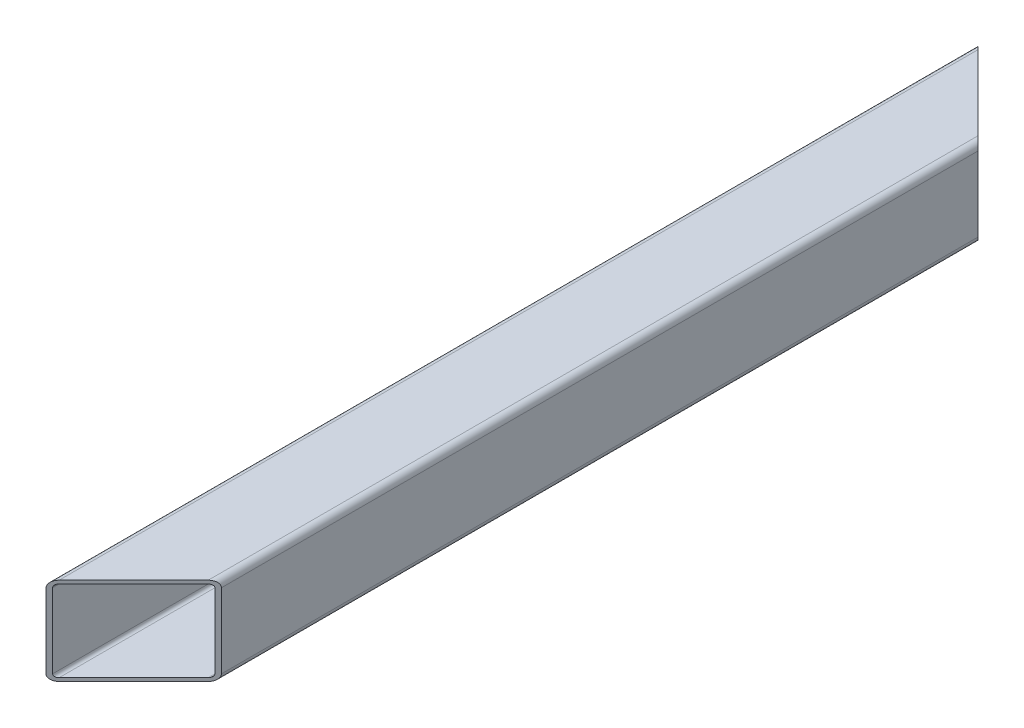
ISO-10303-21;
HEADER;
FILE_DESCRIPTION(('STEP AP214'),'2;1');
FILE_NAME('part.step','',(''),(''),'','','');
FILE_SCHEMA(('AUTOMOTIVE_DESIGN { 1 0 10303 214 1 1 1 1 }'));
ENDSEC;
DATA;
#1=APPLICATION_CONTEXT('core data for automotive mechanical design processes');
#2=APPLICATION_PROTOCOL_DEFINITION('international standard','automotive_design',2000,#1);
#3=PRODUCT_CONTEXT('',#1,'mechanical');
#4=PRODUCT('Part','Part','',(#3));
#5=PRODUCT_RELATED_PRODUCT_CATEGORY('part','',(#4));
#6=PRODUCT_DEFINITION_FORMATION('','',#4);
#7=PRODUCT_DEFINITION_CONTEXT('part definition',#1,'design');
#8=PRODUCT_DEFINITION('design','',#6,#7);
#9=PRODUCT_DEFINITION_SHAPE('','',#8);
#10=(LENGTH_UNIT() NAMED_UNIT(*) SI_UNIT(.MILLI.,.METRE.));
#11=(NAMED_UNIT(*) PLANE_ANGLE_UNIT() SI_UNIT($,.RADIAN.));
#12=(NAMED_UNIT(*) SI_UNIT($,.STERADIAN.) SOLID_ANGLE_UNIT());
#13=UNCERTAINTY_MEASURE_WITH_UNIT(LENGTH_MEASURE(1.E-05),#10,'distance_accuracy_value','');
#14=(GEOMETRIC_REPRESENTATION_CONTEXT(3) GLOBAL_UNCERTAINTY_ASSIGNED_CONTEXT((#13)) GLOBAL_UNIT_ASSIGNED_CONTEXT((#10,
#11,#12)) REPRESENTATION_CONTEXT('',''));
#15=CARTESIAN_POINT('',(0.,0.,0.));
#16=DIRECTION('',(0.,0.,1.));
#17=DIRECTION('',(1.,0.,0.));
#18=AXIS2_PLACEMENT_3D('',#15,#16,#17);
#19=CARTESIAN_POINT('',(34.,34.,425.));
#20=DIRECTION('',(0.,0.,-1.));
#21=DIRECTION('',(-1.,0.,0.));
#22=AXIS2_PLACEMENT_3D('',#19,#20,#21);
#23=CYLINDRICAL_SURFACE('',#22,5.99999999999998);
#24=DIRECTION('',(0.,0.,-1.));
#25=VECTOR('',#24,1.);
#26=CARTESIAN_POINT('',(34.,40.,425.));
#27=LINE('',#26,#25);
#28=CARTESIAN_POINT('',(34.,40.,351.000000000001));
#29=VERTEX_POINT('',#28);
#30=CARTESIAN_POINT('',(34.0000000000001,40.,-351.000000000001));
#31=VERTEX_POINT('',#30);
#32=EDGE_CURVE('E160',#29,#31,#27,.T.);
#33=ORIENTED_EDGE('',*,*,#32,.F.);
#34=CARTESIAN_POINT('',(34.,34.,351.000000000001));
#35=DIRECTION('',(-0.707106781186544,0.,-0.707106781186551));
#36=DIRECTION('',(0.707106781186551,0.,-0.707106781186544));
#37=AXIS2_PLACEMENT_3D('',#34,#35,#36);
#38=ELLIPSE('',#37,8.4852813742385,5.99999999999998);
#39=CARTESIAN_POINT('',(40.,34.,345.000000000001));
#40=VERTEX_POINT('',#39);
#41=EDGE_CURVE('E144',#29,#40,#38,.T.);
#42=ORIENTED_EDGE('',*,*,#41,.T.);
#43=DIRECTION('',(0.,0.,-1.));
#44=VECTOR('',#43,1.);
#45=CARTESIAN_POINT('',(40.,34.,425.));
#46=LINE('',#45,#44);
#47=CARTESIAN_POINT('',(40.,34.,-345.000000000001));
#48=VERTEX_POINT('',#47);
#49=EDGE_CURVE('E183',#40,#48,#46,.T.);
#50=ORIENTED_EDGE('',*,*,#49,.T.);
#51=CARTESIAN_POINT('',(34.,34.,-351.000000000001));
#52=DIRECTION('',(-0.707106781186544,0.,0.707106781186551));
#53=DIRECTION('',(-0.707106781186551,0.,-0.707106781186544));
#54=AXIS2_PLACEMENT_3D('',#51,#52,#53);
#55=ELLIPSE('',#54,8.4852813742385,5.99999999999998);
#56=EDGE_CURVE('E166',#48,#31,#55,.T.);
#57=ORIENTED_EDGE('',*,*,#56,.T.);
#58=EDGE_LOOP('',(#33,#42,#50,#57));
#59=FACE_BOUND('',#58,.T.);
#60=ADVANCED_FACE('F35',(#59),#23,.T.);
#61=CARTESIAN_POINT('',(-34.,40.,425.));
#62=DIRECTION('',(0.,-1.,0.));
#63=DIRECTION('',(0.,0.,-1.));
#64=AXIS2_PLACEMENT_3D('',#61,#62,#63);
#65=PLANE('',#64);
#66=DIRECTION('',(0.,0.,-1.));
#67=VECTOR('',#66,1.);
#68=CARTESIAN_POINT('',(-34.,40.,425.));
#69=LINE('',#68,#67);
#70=CARTESIAN_POINT('',(-34.,40.,419.));
#71=VERTEX_POINT('',#70);
#72=CARTESIAN_POINT('',(-34.,40.,-419.));
#73=VERTEX_POINT('',#72);
#74=EDGE_CURVE('E162',#71,#73,#69,.T.);
#75=ORIENTED_EDGE('',*,*,#74,.F.);
#76=DIRECTION('',(-0.707106781186551,0.,0.707106781186544));
#77=VECTOR('',#76,1.);
#78=CARTESIAN_POINT('',(40.,40.,345.000000000001));
#79=LINE('',#78,#77);
#80=EDGE_CURVE('E147',#29,#71,#79,.T.);
#81=ORIENTED_EDGE('',*,*,#80,.F.);
#82=ORIENTED_EDGE('',*,*,#32,.T.);
#83=DIRECTION('',(0.707106781186551,0.,0.707106781186544));
#84=VECTOR('',#83,1.);
#85=CARTESIAN_POINT('',(40.,40.,-345.000000000001));
#86=LINE('',#85,#84);
#87=EDGE_CURVE('E153',#73,#31,#86,.T.);
#88=ORIENTED_EDGE('',*,*,#87,.F.);
#89=EDGE_LOOP('',(#75,#81,#82,#88));
#90=FACE_BOUND('',#89,.T.);
#91=ADVANCED_FACE('F158',(#90),#65,.F.);
#92=CARTESIAN_POINT('',(-34.,34.,425.));
#93=DIRECTION('',(0.,0.,-1.));
#94=DIRECTION('',(-1.,0.,0.));
#95=AXIS2_PLACEMENT_3D('',#92,#93,#94);
#96=CYLINDRICAL_SURFACE('',#95,5.99999999999998);
#97=DIRECTION('',(0.,0.,-1.));
#98=VECTOR('',#97,1.);
#99=CARTESIAN_POINT('',(-40.,34.,425.));
#100=LINE('',#99,#98);
#101=CARTESIAN_POINT('',(-40.,34.,425.));
#102=VERTEX_POINT('',#101);
#103=CARTESIAN_POINT('',(-40.,34.,-425.));
#104=VERTEX_POINT('',#103);
#105=EDGE_CURVE('E169',#102,#104,#100,.T.);
#106=ORIENTED_EDGE('',*,*,#105,.F.);
#107=CARTESIAN_POINT('',(-34.,34.,419.));
#108=DIRECTION('',(-0.707106781186544,0.,-0.707106781186551));
#109=DIRECTION('',(0.707106781186551,0.,-0.707106781186544));
#110=AXIS2_PLACEMENT_3D('',#107,#108,#109);
#111=ELLIPSE('',#110,8.4852813742385,5.99999999999998);
#112=EDGE_CURVE('E154',#102,#71,#111,.T.);
#113=ORIENTED_EDGE('',*,*,#112,.T.);
#114=ORIENTED_EDGE('',*,*,#74,.T.);
#115=CARTESIAN_POINT('',(-34.,34.,-419.));
#116=DIRECTION('',(-0.707106781186544,0.,0.707106781186551));
#117=DIRECTION('',(-0.707106781186551,0.,-0.707106781186544));
#118=AXIS2_PLACEMENT_3D('',#115,#116,#117);
#119=ELLIPSE('',#118,8.4852813742385,5.99999999999998);
#120=EDGE_CURVE('E207',#73,#104,#119,.T.);
#121=ORIENTED_EDGE('',*,*,#120,.T.);
#122=EDGE_LOOP('',(#106,#113,#114,#121));
#123=FACE_BOUND('',#122,.T.);
#124=ADVANCED_FACE('F318',(#123),#96,.T.);
#125=CARTESIAN_POINT('',(-40.,34.,425.));
#126=DIRECTION('',(1.,0.,0.));
#127=DIRECTION('',(0.,0.,-1.));
#128=AXIS2_PLACEMENT_3D('',#125,#126,#127);
#129=PLANE('',#128);
#130=DIRECTION('',(0.,-1.,0.));
#131=VECTOR('',#130,1.);
#132=CARTESIAN_POINT('',(-40.,34.,-425.));
#133=LINE('',#132,#131);
#134=CARTESIAN_POINT('',(-40.,-34.,-425.));
#135=VERTEX_POINT('',#134);
#136=EDGE_CURVE('E186',#104,#135,#133,.T.);
#137=ORIENTED_EDGE('',*,*,#136,.T.);
#138=DIRECTION('',(0.,0.,-1.));
#139=VECTOR('',#138,1.);
#140=CARTESIAN_POINT('',(-40.,-34.,425.));
#141=LINE('',#140,#139);
#142=CARTESIAN_POINT('',(-40.,-34.,425.));
#143=VERTEX_POINT('',#142);
#144=EDGE_CURVE('E174',#143,#135,#141,.T.);
#145=ORIENTED_EDGE('',*,*,#144,.F.);
#146=DIRECTION('',(0.,-1.,0.));
#147=VECTOR('',#146,1.);
#148=CARTESIAN_POINT('',(-40.,34.,425.));
#149=LINE('',#148,#147);
#150=EDGE_CURVE('E185',#102,#143,#149,.T.);
#151=ORIENTED_EDGE('',*,*,#150,.F.);
#152=ORIENTED_EDGE('',*,*,#105,.T.);
#153=EDGE_LOOP('',(#137,#145,#151,#152));
#154=FACE_BOUND('',#153,.T.);
#155=ADVANCED_FACE('F322',(#154),#129,.F.);
#156=CARTESIAN_POINT('',(-34.,-34.,425.));
#157=DIRECTION('',(0.,0.,-1.));
#158=DIRECTION('',(-1.,0.,0.));
#159=AXIS2_PLACEMENT_3D('',#156,#157,#158);
#160=CYLINDRICAL_SURFACE('',#159,5.99999999999998);
#161=DIRECTION('',(0.,0.,-1.));
#162=VECTOR('',#161,1.);
#163=CARTESIAN_POINT('',(-34.,-40.,425.));
#164=LINE('',#163,#162);
#165=CARTESIAN_POINT('',(-34.,-40.,419.));
#166=VERTEX_POINT('',#165);
#167=CARTESIAN_POINT('',(-34.,-40.,-419.));
#168=VERTEX_POINT('',#167);
#169=EDGE_CURVE('E177',#166,#168,#164,.T.);
#170=ORIENTED_EDGE('',*,*,#169,.F.);
#171=CARTESIAN_POINT('',(-34.,-34.,419.));
#172=DIRECTION('',(-0.707106781186544,0.,-0.707106781186551));
#173=DIRECTION('',(0.707106781186551,0.,-0.707106781186544));
#174=AXIS2_PLACEMENT_3D('',#171,#172,#173);
#175=ELLIPSE('',#174,8.4852813742385,5.99999999999998);
#176=EDGE_CURVE('E245',#166,#143,#175,.T.);
#177=ORIENTED_EDGE('',*,*,#176,.T.);
#178=ORIENTED_EDGE('',*,*,#144,.T.);
#179=CARTESIAN_POINT('',(-34.,-34.,-419.));
#180=DIRECTION('',(-0.707106781186544,0.,0.707106781186551));
#181=DIRECTION('',(-0.707106781186551,0.,-0.707106781186544));
#182=AXIS2_PLACEMENT_3D('',#179,#180,#181);
#183=ELLIPSE('',#182,8.4852813742385,5.99999999999998);
#184=EDGE_CURVE('E210',#135,#168,#183,.T.);
#185=ORIENTED_EDGE('',*,*,#184,.T.);
#186=EDGE_LOOP('',(#170,#177,#178,#185));
#187=FACE_BOUND('',#186,.T.);
#188=ADVANCED_FACE('F328',(#187),#160,.T.);
#189=CARTESIAN_POINT('',(-34.,-40.,425.));
#190=DIRECTION('',(0.,1.,0.));
#191=DIRECTION('',(0.,0.,1.));
#192=AXIS2_PLACEMENT_3D('',#189,#190,#191);
#193=PLANE('',#192);
#194=DIRECTION('',(0.,0.,-1.));
#195=VECTOR('',#194,1.);
#196=CARTESIAN_POINT('',(34.,-40.,425.));
#197=LINE('',#196,#195);
#198=CARTESIAN_POINT('',(34.,-40.,351.000000000001));
#199=VERTEX_POINT('',#198);
#200=CARTESIAN_POINT('',(34.,-40.,-351.000000000001));
#201=VERTEX_POINT('',#200);
#202=EDGE_CURVE('E179',#199,#201,#197,.T.);
#203=ORIENTED_EDGE('',*,*,#202,.F.);
#204=DIRECTION('',(-0.707106781186551,0.,0.707106781186544));
#205=VECTOR('',#204,1.);
#206=CARTESIAN_POINT('',(-37.,-40.,422.));
#207=LINE('',#206,#205);
#208=EDGE_CURVE('E248',#199,#166,#207,.T.);
#209=ORIENTED_EDGE('',*,*,#208,.T.);
#210=ORIENTED_EDGE('',*,*,#169,.T.);
#211=DIRECTION('',(0.707106781186551,0.,0.707106781186544));
#212=VECTOR('',#211,1.);
#213=CARTESIAN_POINT('',(388.,-40.,2.99999999999545));
#214=LINE('',#213,#212);
#215=EDGE_CURVE('E213',#168,#201,#214,.T.);
#216=ORIENTED_EDGE('',*,*,#215,.T.);
#217=EDGE_LOOP('',(#203,#209,#210,#216));
#218=FACE_BOUND('',#217,.T.);
#219=ADVANCED_FACE('F332',(#218),#193,.F.);
#220=CARTESIAN_POINT('',(34.,-34.,425.));
#221=DIRECTION('',(0.,0.,-1.));
#222=DIRECTION('',(-1.,0.,0.));
#223=AXIS2_PLACEMENT_3D('',#220,#221,#222);
#224=CYLINDRICAL_SURFACE('',#223,5.99999999999998);
#225=DIRECTION('',(0.,0.,-1.));
#226=VECTOR('',#225,1.);
#227=CARTESIAN_POINT('',(40.,-34.,425.));
#228=LINE('',#227,#226);
#229=CARTESIAN_POINT('',(40.,-34.,345.000000000001));
#230=VERTEX_POINT('',#229);
#231=CARTESIAN_POINT('',(40.,-34.,-345.000000000001));
#232=VERTEX_POINT('',#231);
#233=EDGE_CURVE('E181',#230,#232,#228,.T.);
#234=ORIENTED_EDGE('',*,*,#233,.F.);
#235=CARTESIAN_POINT('',(34.,-34.,351.000000000001));
#236=DIRECTION('',(-0.707106781186544,0.,-0.707106781186551));
#237=DIRECTION('',(0.707106781186551,0.,-0.707106781186544));
#238=AXIS2_PLACEMENT_3D('',#235,#236,#237);
#239=ELLIPSE('',#238,8.4852813742385,5.99999999999998);
#240=EDGE_CURVE('E49',#230,#199,#239,.T.);
#241=ORIENTED_EDGE('',*,*,#240,.T.);
#242=ORIENTED_EDGE('',*,*,#202,.T.);
#243=CARTESIAN_POINT('',(34.,-34.,-351.000000000001));
#244=DIRECTION('',(-0.707106781186544,0.,0.707106781186551));
#245=DIRECTION('',(-0.707106781186551,0.,-0.707106781186544));
#246=AXIS2_PLACEMENT_3D('',#243,#244,#245);
#247=ELLIPSE('',#246,8.4852813742385,5.99999999999998);
#248=EDGE_CURVE('E216',#201,#232,#247,.T.);
#249=ORIENTED_EDGE('',*,*,#248,.T.);
#250=EDGE_LOOP('',(#234,#241,#242,#249));
#251=FACE_BOUND('',#250,.T.);
#252=ADVANCED_FACE('F336',(#251),#224,.T.);
#253=CARTESIAN_POINT('',(40.,34.,425.));
#254=DIRECTION('',(-1.,0.,0.));
#255=DIRECTION('',(0.,0.,1.));
#256=AXIS2_PLACEMENT_3D('',#253,#254,#255);
#257=PLANE('',#256);
#258=ORIENTED_EDGE('',*,*,#49,.F.);
#259=DIRECTION('',(0.,1.,0.));
#260=VECTOR('',#259,1.);
#261=CARTESIAN_POINT('',(40.,-100.,345.000000000001));
#262=LINE('',#261,#260);
#263=EDGE_CURVE('E149',#230,#40,#262,.T.);
#264=ORIENTED_EDGE('',*,*,#263,.F.);
#265=ORIENTED_EDGE('',*,*,#233,.T.);
#266=DIRECTION('',(0.,1.,0.));
#267=VECTOR('',#266,1.);
#268=CARTESIAN_POINT('',(40.,-100.,-345.000000000001));
#269=LINE('',#268,#267);
#270=EDGE_CURVE('E240',#232,#48,#269,.T.);
#271=ORIENTED_EDGE('',*,*,#270,.T.);
#272=EDGE_LOOP('',(#258,#264,#265,#271));
#273=FACE_BOUND('',#272,.T.);
#274=ADVANCED_FACE('F340',(#273),#257,.F.);
#275=CARTESIAN_POINT('',(-34.,34.,425.));
#276=DIRECTION('',(0.,0.,-1.));
#277=DIRECTION('',(-1.,0.,0.));
#278=AXIS2_PLACEMENT_3D('',#275,#276,#277);
#279=CYLINDRICAL_SURFACE('',#278,3.);
#280=CARTESIAN_POINT('',(-34.,34.,419.));
#281=DIRECTION('',(-0.707106781186544,0.,-0.707106781186551));
#282=DIRECTION('',(0.707106781186551,0.,-0.707106781186544));
#283=AXIS2_PLACEMENT_3D('',#280,#281,#282);
#284=ELLIPSE('',#283,4.24264068711926,3.);
#285=CARTESIAN_POINT('',(-37.,34.,422.));
#286=VERTEX_POINT('',#285);
#287=CARTESIAN_POINT('',(-34.,37.,419.));
#288=VERTEX_POINT('',#287);
#289=EDGE_CURVE('E56',#286,#288,#284,.T.);
#290=ORIENTED_EDGE('',*,*,#289,.F.);
#291=DIRECTION('',(0.,0.,-1.));
#292=VECTOR('',#291,1.);
#293=CARTESIAN_POINT('',(-37.,34.,425.));
#294=LINE('',#293,#292);
#295=CARTESIAN_POINT('',(-37.,34.,-422.));
#296=VERTEX_POINT('',#295);
#297=EDGE_CURVE('E189',#286,#296,#294,.T.);
#298=ORIENTED_EDGE('',*,*,#297,.T.);
#299=CARTESIAN_POINT('',(-34.,34.,-419.));
#300=DIRECTION('',(-0.707106781186544,0.,0.707106781186551));
#301=DIRECTION('',(-0.707106781186551,0.,-0.707106781186544));
#302=AXIS2_PLACEMENT_3D('',#299,#300,#301);
#303=ELLIPSE('',#302,4.24264068711926,3.);
#304=CARTESIAN_POINT('',(-34.,37.,-419.));
#305=VERTEX_POINT('',#304);
#306=EDGE_CURVE('E219',#305,#296,#303,.T.);
#307=ORIENTED_EDGE('',*,*,#306,.F.);
#308=DIRECTION('',(0.,0.,-1.));
#309=VECTOR('',#308,1.);
#310=CARTESIAN_POINT('',(-34.,37.,425.));
#311=LINE('',#310,#309);
#312=EDGE_CURVE('E204',#288,#305,#311,.T.);
#313=ORIENTED_EDGE('',*,*,#312,.F.);
#314=EDGE_LOOP('',(#290,#298,#307,#313));
#315=FACE_BOUND('',#314,.T.);
#316=ADVANCED_FACE('F286',(#315),#279,.F.);
#317=CARTESIAN_POINT('',(-37.,34.,425.));
#318=DIRECTION('',(1.,0.,0.));
#319=DIRECTION('',(0.,1.,0.));
#320=AXIS2_PLACEMENT_3D('',#317,#318,#319);
#321=PLANE('',#320);
#322=DIRECTION('',(0.,1.,0.));
#323=VECTOR('',#322,1.);
#324=CARTESIAN_POINT('',(-37.,34.,422.));
#325=LINE('',#324,#323);
#326=CARTESIAN_POINT('',(-37.,-34.,422.));
#327=VERTEX_POINT('',#326);
#328=EDGE_CURVE('E253',#327,#286,#325,.T.);
#329=ORIENTED_EDGE('',*,*,#328,.F.);
#330=DIRECTION('',(0.,0.,-1.));
#331=VECTOR('',#330,1.);
#332=CARTESIAN_POINT('',(-37.,-34.,425.));
#333=LINE('',#332,#331);
#334=CARTESIAN_POINT('',(-37.,-34.,-422.));
#335=VERTEX_POINT('',#334);
#336=EDGE_CURVE('E192',#327,#335,#333,.T.);
#337=ORIENTED_EDGE('',*,*,#336,.T.);
#338=DIRECTION('',(0.,-1.,0.));
#339=VECTOR('',#338,1.);
#340=CARTESIAN_POINT('',(-37.,34.0000000000001,-422.));
#341=LINE('',#340,#339);
#342=EDGE_CURVE('E222',#296,#335,#341,.T.);
#343=ORIENTED_EDGE('',*,*,#342,.F.);
#344=ORIENTED_EDGE('',*,*,#297,.F.);
#345=EDGE_LOOP('',(#329,#337,#343,#344));
#346=FACE_BOUND('',#345,.T.);
#347=ADVANCED_FACE('F292',(#346),#321,.T.);
#348=CARTESIAN_POINT('',(-34.,-34.,425.));
#349=DIRECTION('',(0.,0.,-1.));
#350=DIRECTION('',(-1.,0.,0.));
#351=AXIS2_PLACEMENT_3D('',#348,#349,#350);
#352=CYLINDRICAL_SURFACE('',#351,3.);
#353=CARTESIAN_POINT('',(-34.,-34.,419.));
#354=DIRECTION('',(-0.707106781186544,0.,-0.707106781186551));
#355=DIRECTION('',(0.707106781186551,0.,-0.707106781186544));
#356=AXIS2_PLACEMENT_3D('',#353,#354,#355);
#357=ELLIPSE('',#356,4.24264068711927,3.);
#358=CARTESIAN_POINT('',(-34.,-37.,419.));
#359=VERTEX_POINT('',#358);
#360=EDGE_CURVE('E255',#359,#327,#357,.T.);
#361=ORIENTED_EDGE('',*,*,#360,.F.);
#362=DIRECTION('',(0.,0.,-1.));
#363=VECTOR('',#362,1.);
#364=CARTESIAN_POINT('',(-34.,-37.,425.));
#365=LINE('',#364,#363);
#366=CARTESIAN_POINT('',(-34.,-37.,-419.));
#367=VERTEX_POINT('',#366);
#368=EDGE_CURVE('E194',#359,#367,#365,.T.);
#369=ORIENTED_EDGE('',*,*,#368,.T.);
#370=CARTESIAN_POINT('',(-34.,-34.,-419.));
#371=DIRECTION('',(-0.707106781186544,0.,0.707106781186551));
#372=DIRECTION('',(-0.707106781186551,0.,-0.707106781186544));
#373=AXIS2_PLACEMENT_3D('',#370,#371,#372);
#374=ELLIPSE('',#373,4.24264068711927,3.);
#375=EDGE_CURVE('E225',#335,#367,#374,.T.);
#376=ORIENTED_EDGE('',*,*,#375,.F.);
#377=ORIENTED_EDGE('',*,*,#336,.F.);
#378=EDGE_LOOP('',(#361,#369,#376,#377));
#379=FACE_BOUND('',#378,.T.);
#380=ADVANCED_FACE('F296',(#379),#352,.F.);
#381=CARTESIAN_POINT('',(-34.,-37.,425.));
#382=DIRECTION('',(0.,1.,0.));
#383=DIRECTION('',(-1.,0.,0.));
#384=AXIS2_PLACEMENT_3D('',#381,#382,#383);
#385=PLANE('',#384);
#386=DIRECTION('',(-0.707106781186551,0.,0.707106781186544));
#387=VECTOR('',#386,1.);
#388=CARTESIAN_POINT('',(-37.,-37.,422.));
#389=LINE('',#388,#387);
#390=CARTESIAN_POINT('',(34.,-37.,351.000000000001));
#391=VERTEX_POINT('',#390);
#392=EDGE_CURVE('E257',#391,#359,#389,.T.);
#393=ORIENTED_EDGE('',*,*,#392,.F.);
#394=DIRECTION('',(0.,0.,-1.));
#395=VECTOR('',#394,1.);
#396=CARTESIAN_POINT('',(34.,-37.,425.));
#397=LINE('',#396,#395);
#398=CARTESIAN_POINT('',(34.,-37.,-351.000000000001));
#399=VERTEX_POINT('',#398);
#400=EDGE_CURVE('E196',#391,#399,#397,.T.);
#401=ORIENTED_EDGE('',*,*,#400,.T.);
#402=DIRECTION('',(0.707106781186551,0.,0.707106781186544));
#403=VECTOR('',#402,1.);
#404=CARTESIAN_POINT('',(388.,-37.,2.99999999999545));
#405=LINE('',#404,#403);
#406=EDGE_CURVE('E228',#367,#399,#405,.T.);
#407=ORIENTED_EDGE('',*,*,#406,.F.);
#408=ORIENTED_EDGE('',*,*,#368,.F.);
#409=EDGE_LOOP('',(#393,#401,#407,#408));
#410=FACE_BOUND('',#409,.T.);
#411=ADVANCED_FACE('F302',(#410),#385,.T.);
#412=CARTESIAN_POINT('',(34.,-34.,425.));
#413=DIRECTION('',(0.,0.,-1.));
#414=DIRECTION('',(-1.,0.,0.));
#415=AXIS2_PLACEMENT_3D('',#412,#413,#414);
#416=CYLINDRICAL_SURFACE('',#415,3.);
#417=CARTESIAN_POINT('',(34.,-34.,351.000000000001));
#418=DIRECTION('',(-0.707106781186544,0.,-0.707106781186551));
#419=DIRECTION('',(0.707106781186551,0.,-0.707106781186544));
#420=AXIS2_PLACEMENT_3D('',#417,#418,#419);
#421=ELLIPSE('',#420,4.24264068711926,3.);
#422=CARTESIAN_POINT('',(37.,-34.,348.000000000001));
#423=VERTEX_POINT('',#422);
#424=EDGE_CURVE('E259',#423,#391,#421,.T.);
#425=ORIENTED_EDGE('',*,*,#424,.F.);
#426=DIRECTION('',(0.,0.,-1.));
#427=VECTOR('',#426,1.);
#428=CARTESIAN_POINT('',(37.,-34.,425.));
#429=LINE('',#428,#427);
#430=CARTESIAN_POINT('',(37.,-34.,-348.000000000001));
#431=VERTEX_POINT('',#430);
#432=EDGE_CURVE('E198',#423,#431,#429,.T.);
#433=ORIENTED_EDGE('',*,*,#432,.T.);
#434=CARTESIAN_POINT('',(34.,-34.,-351.000000000001));
#435=DIRECTION('',(-0.707106781186544,0.,0.707106781186551));
#436=DIRECTION('',(-0.707106781186551,0.,-0.707106781186544));
#437=AXIS2_PLACEMENT_3D('',#434,#435,#436);
#438=ELLIPSE('',#437,4.24264068711926,3.);
#439=EDGE_CURVE('E231',#399,#431,#438,.T.);
#440=ORIENTED_EDGE('',*,*,#439,.F.);
#441=ORIENTED_EDGE('',*,*,#400,.F.);
#442=EDGE_LOOP('',(#425,#433,#440,#441));
#443=FACE_BOUND('',#442,.T.);
#444=ADVANCED_FACE('F305',(#443),#416,.F.);
#445=CARTESIAN_POINT('',(37.,34.,425.));
#446=DIRECTION('',(-1.,0.,0.));
#447=DIRECTION('',(0.,-1.,0.));
#448=AXIS2_PLACEMENT_3D('',#445,#446,#447);
#449=PLANE('',#448);
#450=DIRECTION('',(0.,-1.,0.));
#451=VECTOR('',#450,1.);
#452=CARTESIAN_POINT('',(37.,34.,348.000000000001));
#453=LINE('',#452,#451);
#454=CARTESIAN_POINT('',(37.,34.,348.000000000001));
#455=VERTEX_POINT('',#454);
#456=EDGE_CURVE('E261',#455,#423,#453,.T.);
#457=ORIENTED_EDGE('',*,*,#456,.F.);
#458=DIRECTION('',(0.,0.,-1.));
#459=VECTOR('',#458,1.);
#460=CARTESIAN_POINT('',(37.,34.,425.));
#461=LINE('',#460,#459);
#462=CARTESIAN_POINT('',(37.,34.,-348.000000000001));
#463=VERTEX_POINT('',#462);
#464=EDGE_CURVE('E200',#455,#463,#461,.T.);
#465=ORIENTED_EDGE('',*,*,#464,.T.);
#466=DIRECTION('',(0.,1.,0.));
#467=VECTOR('',#466,1.);
#468=CARTESIAN_POINT('',(37.,33.9999999999999,-348.000000000001));
#469=LINE('',#468,#467);
#470=EDGE_CURVE('E234',#431,#463,#469,.T.);
#471=ORIENTED_EDGE('',*,*,#470,.F.);
#472=ORIENTED_EDGE('',*,*,#432,.F.);
#473=EDGE_LOOP('',(#457,#465,#471,#472));
#474=FACE_BOUND('',#473,.T.);
#475=ADVANCED_FACE('F273',(#474),#449,.T.);
#476=CARTESIAN_POINT('',(34.,34.,425.));
#477=DIRECTION('',(0.,0.,-1.));
#478=DIRECTION('',(-1.,0.,0.));
#479=AXIS2_PLACEMENT_3D('',#476,#477,#478);
#480=CYLINDRICAL_SURFACE('',#479,3.);
#481=CARTESIAN_POINT('',(34.,34.,351.000000000001));
#482=DIRECTION('',(-0.707106781186544,0.,-0.707106781186551));
#483=DIRECTION('',(0.707106781186551,0.,-0.707106781186544));
#484=AXIS2_PLACEMENT_3D('',#481,#482,#483);
#485=ELLIPSE('',#484,4.24264068711926,3.);
#486=CARTESIAN_POINT('',(34.,37.,351.000000000001));
#487=VERTEX_POINT('',#486);
#488=EDGE_CURVE('E263',#487,#455,#485,.T.);
#489=ORIENTED_EDGE('',*,*,#488,.F.);
#490=DIRECTION('',(0.,0.,-1.));
#491=VECTOR('',#490,1.);
#492=CARTESIAN_POINT('',(34.,37.,425.));
#493=LINE('',#492,#491);
#494=CARTESIAN_POINT('',(34.,37.,-351.000000000001));
#495=VERTEX_POINT('',#494);
#496=EDGE_CURVE('E202',#487,#495,#493,.T.);
#497=ORIENTED_EDGE('',*,*,#496,.T.);
#498=CARTESIAN_POINT('',(34.,34.,-351.000000000001));
#499=DIRECTION('',(-0.707106781186544,0.,0.707106781186551));
#500=DIRECTION('',(-0.707106781186551,0.,-0.707106781186544));
#501=AXIS2_PLACEMENT_3D('',#498,#499,#500);
#502=ELLIPSE('',#501,4.24264068711926,3.);
#503=EDGE_CURVE('E237',#463,#495,#502,.T.);
#504=ORIENTED_EDGE('',*,*,#503,.F.);
#505=ORIENTED_EDGE('',*,*,#464,.F.);
#506=EDGE_LOOP('',(#489,#497,#504,#505));
#507=FACE_BOUND('',#506,.T.);
#508=ADVANCED_FACE('F276',(#507),#480,.F.);
#509=CARTESIAN_POINT('',(-34.,37.,425.));
#510=DIRECTION('',(0.,-1.,0.));
#511=DIRECTION('',(1.,0.,0.));
#512=AXIS2_PLACEMENT_3D('',#509,#510,#511);
#513=PLANE('',#512);
#514=DIRECTION('',(0.707106781186551,0.,-0.707106781186544));
#515=VECTOR('',#514,1.);
#516=CARTESIAN_POINT('',(-37.,37.,422.));
#517=LINE('',#516,#515);
#518=EDGE_CURVE('E11',#288,#487,#517,.T.);
#519=ORIENTED_EDGE('',*,*,#518,.F.);
#520=ORIENTED_EDGE('',*,*,#312,.T.);
#521=DIRECTION('',(-0.707106781186551,0.,-0.707106781186544));
#522=VECTOR('',#521,1.);
#523=CARTESIAN_POINT('',(388.,37.,2.99999999999545));
#524=LINE('',#523,#522);
#525=EDGE_CURVE('E42',#495,#305,#524,.T.);
#526=ORIENTED_EDGE('',*,*,#525,.F.);
#527=ORIENTED_EDGE('',*,*,#496,.F.);
#528=EDGE_LOOP('',(#519,#520,#526,#527));
#529=FACE_BOUND('',#528,.T.);
#530=ADVANCED_FACE('F283',(#529),#513,.T.);
#531=CARTESIAN_POINT('',(40.,-100.,-345.000000000001));
#532=DIRECTION('',(-0.707106781186544,0.,0.707106781186551));
#533=DIRECTION('',(0.707106781186551,0.,0.707106781186544));
#534=AXIS2_PLACEMENT_3D('',#531,#532,#533);
#535=PLANE('',#534);
#536=ORIENTED_EDGE('',*,*,#306,.T.);
#537=ORIENTED_EDGE('',*,*,#342,.T.);
#538=ORIENTED_EDGE('',*,*,#375,.T.);
#539=ORIENTED_EDGE('',*,*,#406,.T.);
#540=ORIENTED_EDGE('',*,*,#439,.T.);
#541=ORIENTED_EDGE('',*,*,#470,.T.);
#542=ORIENTED_EDGE('',*,*,#503,.T.);
#543=ORIENTED_EDGE('',*,*,#525,.T.);
#544=EDGE_LOOP('',(#536,#537,#538,#539,#540,#541,#542,#543));
#545=FACE_BOUND('',#544,.T.);
#546=ORIENTED_EDGE('',*,*,#270,.F.);
#547=ORIENTED_EDGE('',*,*,#248,.F.);
#548=ORIENTED_EDGE('',*,*,#215,.F.);
#549=ORIENTED_EDGE('',*,*,#184,.F.);
#550=ORIENTED_EDGE('',*,*,#136,.F.);
#551=ORIENTED_EDGE('',*,*,#120,.F.);
#552=ORIENTED_EDGE('',*,*,#87,.T.);
#553=ORIENTED_EDGE('',*,*,#56,.F.);
#554=EDGE_LOOP('',(#546,#547,#548,#549,#550,#551,#552,#553));
#555=FACE_BOUND('',#554,.T.);
#556=ADVANCED_FACE('F279',(#545,#555),#535,.F.);
#557=CARTESIAN_POINT('',(40.,-100.,345.000000000001));
#558=DIRECTION('',(-0.707106781186544,0.,-0.707106781186551));
#559=DIRECTION('',(-0.707106781186551,0.,0.707106781186544));
#560=AXIS2_PLACEMENT_3D('',#557,#558,#559);
#561=PLANE('',#560);
#562=ORIENTED_EDGE('',*,*,#289,.T.);
#563=ORIENTED_EDGE('',*,*,#518,.T.);
#564=ORIENTED_EDGE('',*,*,#488,.T.);
#565=ORIENTED_EDGE('',*,*,#456,.T.);
#566=ORIENTED_EDGE('',*,*,#424,.T.);
#567=ORIENTED_EDGE('',*,*,#392,.T.);
#568=ORIENTED_EDGE('',*,*,#360,.T.);
#569=ORIENTED_EDGE('',*,*,#328,.T.);
#570=EDGE_LOOP('',(#562,#563,#564,#565,#566,#567,#568,#569));
#571=FACE_BOUND('',#570,.T.);
#572=ORIENTED_EDGE('',*,*,#80,.T.);
#573=ORIENTED_EDGE('',*,*,#112,.F.);
#574=ORIENTED_EDGE('',*,*,#150,.T.);
#575=ORIENTED_EDGE('',*,*,#176,.F.);
#576=ORIENTED_EDGE('',*,*,#208,.F.);
#577=ORIENTED_EDGE('',*,*,#240,.F.);
#578=ORIENTED_EDGE('',*,*,#263,.T.);
#579=ORIENTED_EDGE('',*,*,#41,.F.);
#580=EDGE_LOOP('',(#572,#573,#574,#575,#576,#577,#578,#579));
#581=FACE_BOUND('',#580,.T.);
#582=ADVANCED_FACE('F146',(#571,#581),#561,.F.);
#583=CLOSED_SHELL('',(#60,#91,#124,#155,#188,#219,#252,#274,#316,#347,#380,#411,#444,#475,#508,
#530,#556,#582));
#584=MANIFOLD_SOLID_BREP('B2',#583);
#585=ADVANCED_BREP_SHAPE_REPRESENTATION('',(#18,#584),#14);
#586=SHAPE_DEFINITION_REPRESENTATION(#9,#585);
ENDSEC;
END-ISO-10303-21;
